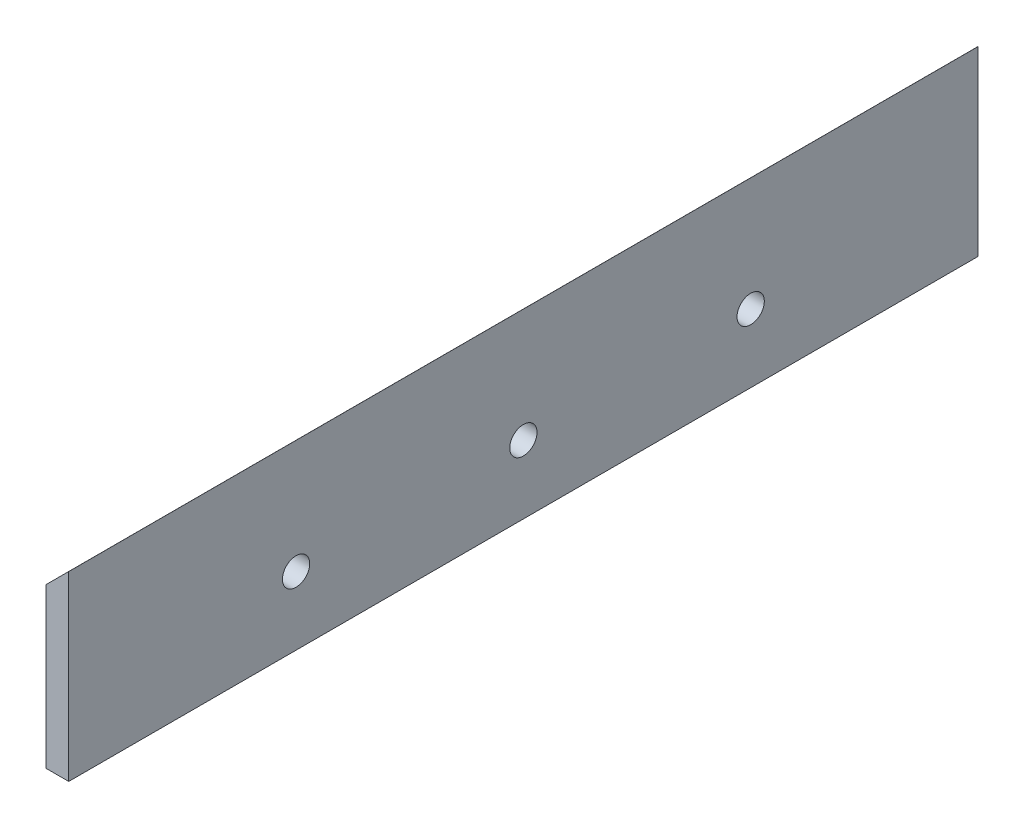
ISO-10303-21;
HEADER;
FILE_DESCRIPTION(('STEP AP214'),'2;1');
FILE_NAME('part.step','',(''),(''),'','','');
FILE_SCHEMA(('AUTOMOTIVE_DESIGN { 1 0 10303 214 1 1 1 1 }'));
ENDSEC;
DATA;
#1=APPLICATION_CONTEXT('core data for automotive mechanical design processes');
#2=APPLICATION_PROTOCOL_DEFINITION('international standard','automotive_design',2000,#1);
#3=PRODUCT_CONTEXT('',#1,'mechanical');
#4=PRODUCT('Part','Part','',(#3));
#5=PRODUCT_RELATED_PRODUCT_CATEGORY('part','',(#4));
#6=PRODUCT_DEFINITION_FORMATION('','',#4);
#7=PRODUCT_DEFINITION_CONTEXT('part definition',#1,'design');
#8=PRODUCT_DEFINITION('design','',#6,#7);
#9=PRODUCT_DEFINITION_SHAPE('','',#8);
#10=(LENGTH_UNIT() NAMED_UNIT(*) SI_UNIT(.MILLI.,.METRE.));
#11=(NAMED_UNIT(*) PLANE_ANGLE_UNIT() SI_UNIT($,.RADIAN.));
#12=(NAMED_UNIT(*) SI_UNIT($,.STERADIAN.) SOLID_ANGLE_UNIT());
#13=UNCERTAINTY_MEASURE_WITH_UNIT(LENGTH_MEASURE(1.E-05),#10,'distance_accuracy_value','');
#14=(GEOMETRIC_REPRESENTATION_CONTEXT(3) GLOBAL_UNCERTAINTY_ASSIGNED_CONTEXT((#13)) GLOBAL_UNIT_ASSIGNED_CONTEXT((#10,
#11,#12)) REPRESENTATION_CONTEXT('',''));
#15=CARTESIAN_POINT('',(0.,0.,0.));
#16=DIRECTION('',(0.,0.,1.));
#17=DIRECTION('',(1.,0.,0.));
#18=AXIS2_PLACEMENT_3D('',#15,#16,#17);
#19=CARTESIAN_POINT('',(203.623972774504,1041.16287141747,200.));
#20=DIRECTION('',(-1.,0.,0.));
#21=DIRECTION('',(0.,0.,1.));
#22=AXIS2_PLACEMENT_3D('',#19,#20,#21);
#23=PLANE('',#22);
#24=CARTESIAN_POINT('',(203.623972774504,1016.17690399324,100.));
#25=DIRECTION('',(1.,0.,0.));
#26=DIRECTION('',(0.,0.,-1.));
#27=AXIS2_PLACEMENT_3D('',#24,#25,#26);
#28=CIRCLE('',#27,3.);
#29=CARTESIAN_POINT('',(203.623972774504,1016.17690399324,97.));
#30=VERTEX_POINT('',#29);
#31=EDGE_CURVE('E127',#30,#30,#28,.T.);
#32=ORIENTED_EDGE('',*,*,#31,.F.);
#33=EDGE_LOOP('',(#32));
#34=FACE_BOUND('',#33,.T.);
#35=CARTESIAN_POINT('',(203.623972774504,1016.17690399324,150.));
#36=DIRECTION('',(1.,0.,0.));
#37=DIRECTION('',(0.,0.,-1.));
#38=AXIS2_PLACEMENT_3D('',#35,#36,#37);
#39=CIRCLE('',#38,3.);
#40=CARTESIAN_POINT('',(203.623972774504,1016.17690399324,147.));
#41=VERTEX_POINT('',#40);
#42=EDGE_CURVE('E128',#41,#41,#39,.T.);
#43=ORIENTED_EDGE('',*,*,#42,.F.);
#44=EDGE_LOOP('',(#43));
#45=FACE_BOUND('',#44,.T.);
#46=CARTESIAN_POINT('',(203.623972774504,1016.17690399324,50.));
#47=DIRECTION('',(1.,0.,0.));
#48=DIRECTION('',(0.,0.,-1.));
#49=AXIS2_PLACEMENT_3D('',#46,#47,#48);
#50=CIRCLE('',#49,3.);
#51=CARTESIAN_POINT('',(203.623972774504,1016.17690399324,47.));
#52=VERTEX_POINT('',#51);
#53=EDGE_CURVE('E120',#52,#52,#50,.T.);
#54=ORIENTED_EDGE('',*,*,#53,.F.);
#55=EDGE_LOOP('',(#54));
#56=FACE_BOUND('',#55,.T.);
#57=DIRECTION('',(0.,1.,0.));
#58=VECTOR('',#57,1.);
#59=CARTESIAN_POINT('',(203.623972774504,1041.16287141747,0.));
#60=LINE('',#59,#58);
#61=CARTESIAN_POINT('',(203.623972774504,1001.17690399324,0.));
#62=VERTEX_POINT('',#61);
#63=CARTESIAN_POINT('',(203.623972774504,1041.16287141747,0.));
#64=VERTEX_POINT('',#63);
#65=EDGE_CURVE('E97',#62,#64,#60,.T.);
#66=ORIENTED_EDGE('',*,*,#65,.T.);
#67=DIRECTION('',(0.,0.,-1.));
#68=VECTOR('',#67,1.);
#69=CARTESIAN_POINT('',(203.623972774504,1041.16287141747,200.));
#70=LINE('',#69,#68);
#71=CARTESIAN_POINT('',(203.623972774504,1041.16287141747,200.));
#72=VERTEX_POINT('',#71);
#73=EDGE_CURVE('E80',#72,#64,#70,.T.);
#74=ORIENTED_EDGE('',*,*,#73,.F.);
#75=DIRECTION('',(0.,1.,0.));
#76=VECTOR('',#75,1.);
#77=CARTESIAN_POINT('',(203.623972774504,1041.16287141747,200.));
#78=LINE('',#77,#76);
#79=CARTESIAN_POINT('',(203.623972774504,1001.17690399324,200.));
#80=VERTEX_POINT('',#79);
#81=EDGE_CURVE('E85',#80,#72,#78,.T.);
#82=ORIENTED_EDGE('',*,*,#81,.F.);
#83=DIRECTION('',(0.,0.,-1.));
#84=VECTOR('',#83,1.);
#85=CARTESIAN_POINT('',(203.623972774504,1001.17690399324,200.));
#86=LINE('',#85,#84);
#87=EDGE_CURVE('E104',#80,#62,#86,.T.);
#88=ORIENTED_EDGE('',*,*,#87,.T.);
#89=EDGE_LOOP('',(#66,#74,#82,#88));
#90=FACE_BOUND('',#89,.T.);
#91=ADVANCED_FACE('F33',(#34,#45,#56,#90),#23,.F.);
#92=CARTESIAN_POINT('',(198.623972774504,1041.17690399324,200.));
#93=DIRECTION('',(-0.002806504102076,-0.999996061759608,0.));
#94=DIRECTION('',(0.999996061759608,-0.002806504102076,0.));
#95=AXIS2_PLACEMENT_3D('',#92,#93,#94);
#96=PLANE('',#95);
#97=DIRECTION('',(-0.999996061759608,0.002806504102076,0.));
#98=VECTOR('',#97,1.);
#99=CARTESIAN_POINT('',(198.623972774504,1041.17690399324,0.));
#100=LINE('',#99,#98);
#101=CARTESIAN_POINT('',(203.609979471148,1041.16291068989,0.));
#102=VERTEX_POINT('',#101);
#103=EDGE_CURVE('E112',#64,#102,#100,.T.);
#104=ORIENTED_EDGE('',*,*,#103,.T.);
#105=DIRECTION('',(0.,0.,1.));
#106=VECTOR('',#105,1.);
#107=CARTESIAN_POINT('',(203.609979471148,1041.16291068989,200.));
#108=LINE('',#107,#106);
#109=CARTESIAN_POINT('',(203.609979471148,1041.16291068989,200.));
#110=VERTEX_POINT('',#109);
#111=EDGE_CURVE('E41',#102,#110,#108,.T.);
#112=ORIENTED_EDGE('',*,*,#111,.T.);
#113=DIRECTION('',(-0.999996061759608,0.002806504102076,0.));
#114=VECTOR('',#113,1.);
#115=CARTESIAN_POINT('',(198.623972774504,1041.17690399324,200.));
#116=LINE('',#115,#114);
#117=EDGE_CURVE('E76',#72,#110,#116,.T.);
#118=ORIENTED_EDGE('',*,*,#117,.F.);
#119=ORIENTED_EDGE('',*,*,#73,.T.);
#120=EDGE_LOOP('',(#104,#112,#118,#119));
#121=FACE_BOUND('',#120,.T.);
#122=ADVANCED_FACE('F78',(#121),#96,.F.);
#123=CARTESIAN_POINT('',(198.623972774504,1001.17690399324,200.));
#124=DIRECTION('',(1.,0.,0.));
#125=DIRECTION('',(0.,0.,-1.));
#126=AXIS2_PLACEMENT_3D('',#123,#124,#125);
#127=PLANE('',#126);
#128=CARTESIAN_POINT('',(198.623972774504,1016.17690399324,100.));
#129=DIRECTION('',(1.,0.,0.));
#130=DIRECTION('',(0.,0.,-1.));
#131=AXIS2_PLACEMENT_3D('',#128,#129,#130);
#132=CIRCLE('',#131,3.);
#133=CARTESIAN_POINT('',(198.623972774504,1016.17690399324,97.));
#134=VERTEX_POINT('',#133);
#135=EDGE_CURVE('E123',#134,#134,#132,.F.);
#136=ORIENTED_EDGE('',*,*,#135,.F.);
#137=EDGE_LOOP('',(#136));
#138=FACE_BOUND('',#137,.T.);
#139=CARTESIAN_POINT('',(198.623972774504,1016.17690399324,150.));
#140=DIRECTION('',(1.,0.,0.));
#141=DIRECTION('',(0.,0.,-1.));
#142=AXIS2_PLACEMENT_3D('',#139,#140,#141);
#143=CIRCLE('',#142,3.);
#144=CARTESIAN_POINT('',(198.623972774504,1016.17690399324,147.));
#145=VERTEX_POINT('',#144);
#146=EDGE_CURVE('E124',#145,#145,#143,.F.);
#147=ORIENTED_EDGE('',*,*,#146,.F.);
#148=EDGE_LOOP('',(#147));
#149=FACE_BOUND('',#148,.T.);
#150=CARTESIAN_POINT('',(198.623972774504,1016.17690399324,50.));
#151=DIRECTION('',(1.,0.,0.));
#152=DIRECTION('',(0.,0.,-1.));
#153=AXIS2_PLACEMENT_3D('',#150,#151,#152);
#154=CIRCLE('',#153,3.);
#155=CARTESIAN_POINT('',(198.623972774504,1016.17690399324,47.));
#156=VERTEX_POINT('',#155);
#157=EDGE_CURVE('E115',#156,#156,#154,.F.);
#158=ORIENTED_EDGE('',*,*,#157,.F.);
#159=EDGE_LOOP('',(#158));
#160=FACE_BOUND('',#159,.T.);
#161=DIRECTION('',(0.,-1.,0.));
#162=VECTOR('',#161,1.);
#163=CARTESIAN_POINT('',(198.623972774504,1001.17690399324,200.));
#164=LINE('',#163,#162);
#165=CARTESIAN_POINT('',(198.623972774504,1036.17690399324,200.));
#166=VERTEX_POINT('',#165);
#167=CARTESIAN_POINT('',(198.623972774504,1001.17690399324,200.));
#168=VERTEX_POINT('',#167);
#169=EDGE_CURVE('E84',#166,#168,#164,.T.);
#170=ORIENTED_EDGE('',*,*,#169,.F.);
#171=DIRECTION('',(0.,0.,-1.));
#172=VECTOR('',#171,1.);
#173=CARTESIAN_POINT('',(198.623972774504,1036.17690399324,200.));
#174=LINE('',#173,#172);
#175=CARTESIAN_POINT('',(198.623972774504,1036.17690399324,0.));
#176=VERTEX_POINT('',#175);
#177=EDGE_CURVE('E98',#166,#176,#174,.T.);
#178=ORIENTED_EDGE('',*,*,#177,.T.);
#179=DIRECTION('',(0.,-1.,0.));
#180=VECTOR('',#179,1.);
#181=CARTESIAN_POINT('',(198.623972774504,1001.17690399324,0.));
#182=LINE('',#181,#180);
#183=CARTESIAN_POINT('',(198.623972774504,1001.17690399324,0.));
#184=VERTEX_POINT('',#183);
#185=EDGE_CURVE('E110',#176,#184,#182,.T.);
#186=ORIENTED_EDGE('',*,*,#185,.T.);
#187=DIRECTION('',(0.,0.,-1.));
#188=VECTOR('',#187,1.);
#189=CARTESIAN_POINT('',(198.623972774504,1001.17690399324,200.));
#190=LINE('',#189,#188);
#191=EDGE_CURVE('E99',#168,#184,#190,.T.);
#192=ORIENTED_EDGE('',*,*,#191,.F.);
#193=EDGE_LOOP('',(#170,#178,#186,#192));
#194=FACE_BOUND('',#193,.T.);
#195=ADVANCED_FACE('F166',(#138,#149,#160,#194),#127,.F.);
#196=CARTESIAN_POINT('',(203.623972774504,1001.17690399324,200.));
#197=DIRECTION('',(0.,1.,0.));
#198=DIRECTION('',(0.,0.,1.));
#199=AXIS2_PLACEMENT_3D('',#196,#197,#198);
#200=PLANE('',#199);
#201=DIRECTION('',(1.,0.,0.));
#202=VECTOR('',#201,1.);
#203=CARTESIAN_POINT('',(203.623972774504,1001.17690399324,0.));
#204=LINE('',#203,#202);
#205=EDGE_CURVE('E94',#184,#62,#204,.T.);
#206=ORIENTED_EDGE('',*,*,#205,.T.);
#207=ORIENTED_EDGE('',*,*,#87,.F.);
#208=DIRECTION('',(1.,0.,0.));
#209=VECTOR('',#208,1.);
#210=CARTESIAN_POINT('',(203.623972774504,1001.17690399324,200.));
#211=LINE('',#210,#209);
#212=EDGE_CURVE('E90',#168,#80,#211,.T.);
#213=ORIENTED_EDGE('',*,*,#212,.F.);
#214=ORIENTED_EDGE('',*,*,#191,.T.);
#215=EDGE_LOOP('',(#206,#207,#213,#214));
#216=FACE_BOUND('',#215,.T.);
#217=ADVANCED_FACE('F161',(#216),#200,.F.);
#218=CARTESIAN_POINT('',(0.,0.,200.));
#219=DIRECTION('',(0.,0.,-1.));
#220=DIRECTION('',(-1.,0.,0.));
#221=AXIS2_PLACEMENT_3D('',#218,#219,#220);
#222=PLANE('',#221);
#223=ORIENTED_EDGE('',*,*,#117,.T.);
#224=DIRECTION('',(0.707106781186548,0.707106781186548,0.));
#225=VECTOR('',#224,1.);
#226=CARTESIAN_POINT('',(198.623972774504,1036.17690399324,200.));
#227=LINE('',#226,#225);
#228=EDGE_CURVE('E11',#110,#166,#227,.F.);
#229=ORIENTED_EDGE('',*,*,#228,.T.);
#230=ORIENTED_EDGE('',*,*,#169,.T.);
#231=ORIENTED_EDGE('',*,*,#212,.T.);
#232=ORIENTED_EDGE('',*,*,#81,.T.);
#233=EDGE_LOOP('',(#223,#229,#230,#231,#232));
#234=FACE_BOUND('',#233,.T.);
#235=ADVANCED_FACE('F88',(#234),#222,.F.);
#236=CARTESIAN_POINT('',(0.,0.,0.));
#237=DIRECTION('',(0.,0.,-1.));
#238=DIRECTION('',(-1.,0.,0.));
#239=AXIS2_PLACEMENT_3D('',#236,#237,#238);
#240=PLANE('',#239);
#241=ORIENTED_EDGE('',*,*,#185,.F.);
#242=DIRECTION('',(-0.707106781186548,-0.707106781186548,0.));
#243=VECTOR('',#242,1.);
#244=CARTESIAN_POINT('',(-418.776465609368,418.776465609368,0.));
#245=LINE('',#244,#243);
#246=EDGE_CURVE('E55',#176,#102,#245,.F.);
#247=ORIENTED_EDGE('',*,*,#246,.T.);
#248=ORIENTED_EDGE('',*,*,#103,.F.);
#249=ORIENTED_EDGE('',*,*,#65,.F.);
#250=ORIENTED_EDGE('',*,*,#205,.F.);
#251=EDGE_LOOP('',(#241,#247,#248,#249,#250));
#252=FACE_BOUND('',#251,.T.);
#253=ADVANCED_FACE('F155',(#252),#240,.T.);
#254=CARTESIAN_POINT('',(198.623972774504,1036.17690399324,200.));
#255=DIRECTION('',(0.707106781186547,-0.707106781186547,0.));
#256=DIRECTION('',(0.,0.,-1.));
#257=AXIS2_PLACEMENT_3D('',#254,#255,#256);
#258=PLANE('',#257);
#259=ORIENTED_EDGE('',*,*,#228,.F.);
#260=ORIENTED_EDGE('',*,*,#111,.F.);
#261=ORIENTED_EDGE('',*,*,#246,.F.);
#262=ORIENTED_EDGE('',*,*,#177,.F.);
#263=EDGE_LOOP('',(#259,#260,#261,#262));
#264=FACE_BOUND('',#263,.T.);
#265=ADVANCED_FACE('F35',(#264),#258,.F.);
#266=CARTESIAN_POINT('',(190.138691400266,1016.17690399324,50.));
#267=DIRECTION('',(1.,0.,0.));
#268=DIRECTION('',(0.,0.,-1.));
#269=AXIS2_PLACEMENT_3D('',#266,#267,#268);
#270=CYLINDRICAL_SURFACE('',#269,3.);
#271=ORIENTED_EDGE('',*,*,#157,.T.);
#272=EDGE_LOOP('',(#271));
#273=FACE_BOUND('',#272,.T.);
#274=ORIENTED_EDGE('',*,*,#53,.T.);
#275=EDGE_LOOP('',(#274));
#276=FACE_BOUND('',#275,.T.);
#277=ADVANCED_FACE('F144',(#273,#276),#270,.F.);
#278=CARTESIAN_POINT('',(190.138691400266,1016.17690399324,150.));
#279=DIRECTION('',(1.,0.,0.));
#280=DIRECTION('',(0.,0.,-1.));
#281=AXIS2_PLACEMENT_3D('',#278,#279,#280);
#282=CYLINDRICAL_SURFACE('',#281,3.);
#283=ORIENTED_EDGE('',*,*,#146,.T.);
#284=EDGE_LOOP('',(#283));
#285=FACE_BOUND('',#284,.T.);
#286=ORIENTED_EDGE('',*,*,#42,.T.);
#287=EDGE_LOOP('',(#286));
#288=FACE_BOUND('',#287,.T.);
#289=ADVANCED_FACE('F146',(#285,#288),#282,.F.);
#290=CARTESIAN_POINT('',(190.138691400266,1016.17690399324,100.));
#291=DIRECTION('',(1.,0.,0.));
#292=DIRECTION('',(0.,0.,-1.));
#293=AXIS2_PLACEMENT_3D('',#290,#291,#292);
#294=CYLINDRICAL_SURFACE('',#293,3.);
#295=ORIENTED_EDGE('',*,*,#135,.T.);
#296=EDGE_LOOP('',(#295));
#297=FACE_BOUND('',#296,.T.);
#298=ORIENTED_EDGE('',*,*,#31,.T.);
#299=EDGE_LOOP('',(#298));
#300=FACE_BOUND('',#299,.T.);
#301=ADVANCED_FACE('F136',(#297,#300),#294,.F.);
#302=CLOSED_SHELL('',(#91,#122,#195,#217,#235,#253,#265,#277,#289,#301));
#303=MANIFOLD_SOLID_BREP('B2',#302);
#304=ADVANCED_BREP_SHAPE_REPRESENTATION('',(#18,#303),#14);
#305=SHAPE_DEFINITION_REPRESENTATION(#9,#304);
ENDSEC;
END-ISO-10303-21;
